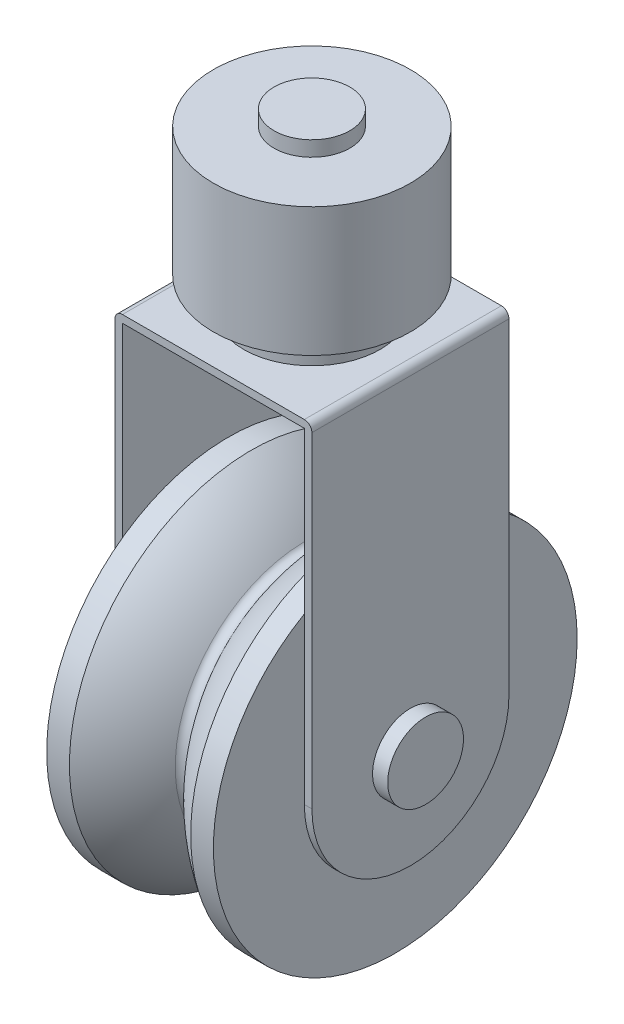
ISO-10303-21;
HEADER;
FILE_DESCRIPTION(('STEP AP214'),'2;1');
FILE_NAME('part.step','',(''),(''),'','','');
FILE_SCHEMA(('AUTOMOTIVE_DESIGN { 1 0 10303 214 1 1 1 1 }'));
ENDSEC;
DATA;
#1=APPLICATION_CONTEXT('core data for automotive mechanical design processes');
#2=APPLICATION_PROTOCOL_DEFINITION('international standard','automotive_design',2000,#1);
#3=PRODUCT_CONTEXT('',#1,'mechanical');
#4=PRODUCT('Part','Part','',(#3));
#5=PRODUCT_RELATED_PRODUCT_CATEGORY('part','',(#4));
#6=PRODUCT_DEFINITION_FORMATION('','',#4);
#7=PRODUCT_DEFINITION_CONTEXT('part definition',#1,'design');
#8=PRODUCT_DEFINITION('design','',#6,#7);
#9=PRODUCT_DEFINITION_SHAPE('','',#8);
#10=(LENGTH_UNIT() NAMED_UNIT(*) SI_UNIT(.MILLI.,.METRE.));
#11=(NAMED_UNIT(*) PLANE_ANGLE_UNIT() SI_UNIT($,.RADIAN.));
#12=(NAMED_UNIT(*) SI_UNIT($,.STERADIAN.) SOLID_ANGLE_UNIT());
#13=UNCERTAINTY_MEASURE_WITH_UNIT(LENGTH_MEASURE(1.E-05),#10,'distance_accuracy_value','');
#14=(GEOMETRIC_REPRESENTATION_CONTEXT(3) GLOBAL_UNCERTAINTY_ASSIGNED_CONTEXT((#13)) GLOBAL_UNIT_ASSIGNED_CONTEXT((#10,
#11,#12)) REPRESENTATION_CONTEXT('',''));
#15=CARTESIAN_POINT('',(0.,0.,0.));
#16=DIRECTION('',(0.,0.,1.));
#17=DIRECTION('',(1.,0.,0.));
#18=AXIS2_PLACEMENT_3D('',#15,#16,#17);
#19=CARTESIAN_POINT('',(-11.,0.,0.));
#20=DIRECTION('',(-1.,0.,0.));
#21=DIRECTION('',(0.,0.,1.));
#22=AXIS2_PLACEMENT_3D('',#19,#20,#21);
#23=PLANE('',#22);
#24=CARTESIAN_POINT('',(-11.,0.,0.));
#25=DIRECTION('',(1.,0.,0.));
#26=DIRECTION('',(0.,0.,-1.));
#27=AXIS2_PLACEMENT_3D('',#24,#25,#26);
#28=CIRCLE('',#27,24.);
#29=CARTESIAN_POINT('',(-11.,0.,-24.));
#30=VERTEX_POINT('',#29);
#31=EDGE_CURVE('E224',#30,#30,#28,.T.);
#32=ORIENTED_EDGE('',*,*,#31,.F.);
#33=EDGE_LOOP('',(#32));
#34=FACE_BOUND('',#33,.T.);
#35=CARTESIAN_POINT('',(-11.,0.,0.));
#36=DIRECTION('',(-1.,0.,0.));
#37=DIRECTION('',(0.,0.,1.));
#38=AXIS2_PLACEMENT_3D('',#35,#36,#37);
#39=CIRCLE('',#38,5.);
#40=CARTESIAN_POINT('',(-11.,0.,5.));
#41=VERTEX_POINT('',#40);
#42=EDGE_CURVE('E155',#41,#41,#39,.F.);
#43=ORIENTED_EDGE('',*,*,#42,.T.);
#44=EDGE_LOOP('',(#43));
#45=FACE_BOUND('',#44,.T.);
#46=ADVANCED_FACE('F46',(#34,#45),#23,.T.);
#47=CARTESIAN_POINT('',(-13.,0.,13.));
#48=DIRECTION('',(1.,0.,0.));
#49=DIRECTION('',(0.,0.,-1.));
#50=AXIS2_PLACEMENT_3D('',#47,#48,#49);
#51=PLANE('',#50);
#52=CARTESIAN_POINT('',(-13.,0.,0.));
#53=DIRECTION('',(1.,0.,0.));
#54=DIRECTION('',(0.,0.,-1.));
#55=AXIS2_PLACEMENT_3D('',#52,#53,#54);
#56=CIRCLE('',#55,5.);
#57=CARTESIAN_POINT('',(-13.,0.,-5.));
#58=VERTEX_POINT('',#57);
#59=EDGE_CURVE('E166',#58,#58,#56,.T.);
#60=ORIENTED_EDGE('',*,*,#59,.T.);
#61=EDGE_LOOP('',(#60));
#62=FACE_BOUND('',#61,.T.);
#63=DIRECTION('',(0.,-1.,0.));
#64=VECTOR('',#63,1.);
#65=CARTESIAN_POINT('',(-13.,0.,13.));
#66=LINE('',#65,#64);
#67=CARTESIAN_POINT('',(-13.,43.,13.));
#68=VERTEX_POINT('',#67);
#69=CARTESIAN_POINT('',(-13.,0.,13.));
#70=VERTEX_POINT('',#69);
#71=EDGE_CURVE('E177',#68,#70,#66,.T.);
#72=ORIENTED_EDGE('',*,*,#71,.F.);
#73=DIRECTION('',(0.,0.,-1.));
#74=VECTOR('',#73,1.);
#75=CARTESIAN_POINT('',(-13.,43.,-13.));
#76=LINE('',#75,#74);
#77=CARTESIAN_POINT('',(-13.,43.,-13.));
#78=VERTEX_POINT('',#77);
#79=EDGE_CURVE('E11',#68,#78,#76,.T.);
#80=ORIENTED_EDGE('',*,*,#79,.T.);
#81=DIRECTION('',(0.,-1.,0.));
#82=VECTOR('',#81,1.);
#83=CARTESIAN_POINT('',(-13.,0.,-13.));
#84=LINE('',#83,#82);
#85=CARTESIAN_POINT('',(-13.,0.,-13.));
#86=VERTEX_POINT('',#85);
#87=EDGE_CURVE('E146',#78,#86,#84,.T.);
#88=ORIENTED_EDGE('',*,*,#87,.T.);
#89=CARTESIAN_POINT('',(-13.,0.,0.));
#90=DIRECTION('',(1.,0.,0.));
#91=DIRECTION('',(0.,0.,-1.));
#92=AXIS2_PLACEMENT_3D('',#89,#90,#91);
#93=CIRCLE('',#92,13.);
#94=EDGE_CURVE('E145',#86,#70,#93,.F.);
#95=ORIENTED_EDGE('',*,*,#94,.T.);
#96=EDGE_LOOP('',(#72,#80,#88,#95));
#97=FACE_BOUND('',#96,.T.);
#98=ADVANCED_FACE('F273',(#62,#97),#51,.F.);
#99=CARTESIAN_POINT('',(-12.,0.,13.));
#100=DIRECTION('',(1.,0.,0.));
#101=DIRECTION('',(0.,0.,-1.));
#102=AXIS2_PLACEMENT_3D('',#99,#100,#101);
#103=PLANE('',#102);
#104=CARTESIAN_POINT('',(-12.,0.,0.));
#105=DIRECTION('',(-1.,0.,0.));
#106=DIRECTION('',(0.,0.,1.));
#107=AXIS2_PLACEMENT_3D('',#104,#105,#106);
#108=CIRCLE('',#107,5.);
#109=CARTESIAN_POINT('',(-12.,0.,5.));
#110=VERTEX_POINT('',#109);
#111=EDGE_CURVE('E162',#110,#110,#108,.T.);
#112=ORIENTED_EDGE('',*,*,#111,.T.);
#113=EDGE_LOOP('',(#112));
#114=FACE_BOUND('',#113,.T.);
#115=DIRECTION('',(0.,-1.,0.));
#116=VECTOR('',#115,1.);
#117=CARTESIAN_POINT('',(-12.,0.,13.));
#118=LINE('',#117,#116);
#119=CARTESIAN_POINT('',(-12.,43.,13.));
#120=VERTEX_POINT('',#119);
#121=CARTESIAN_POINT('',(-12.,0.,13.));
#122=VERTEX_POINT('',#121);
#123=EDGE_CURVE('E151',#120,#122,#118,.T.);
#124=ORIENTED_EDGE('',*,*,#123,.T.);
#125=CARTESIAN_POINT('',(-12.,0.,0.));
#126=DIRECTION('',(-1.,0.,0.));
#127=DIRECTION('',(0.,0.,1.));
#128=AXIS2_PLACEMENT_3D('',#125,#126,#127);
#129=CIRCLE('',#128,13.);
#130=CARTESIAN_POINT('',(-12.,0.,-13.));
#131=VERTEX_POINT('',#130);
#132=EDGE_CURVE('E143',#131,#122,#129,.T.);
#133=ORIENTED_EDGE('',*,*,#132,.F.);
#134=DIRECTION('',(0.,-1.,0.));
#135=VECTOR('',#134,1.);
#136=CARTESIAN_POINT('',(-12.,0.,-13.));
#137=LINE('',#136,#135);
#138=CARTESIAN_POINT('',(-12.,43.,-13.));
#139=VERTEX_POINT('',#138);
#140=EDGE_CURVE('E126',#139,#131,#137,.T.);
#141=ORIENTED_EDGE('',*,*,#140,.F.);
#142=DIRECTION('',(0.,0.,-1.));
#143=VECTOR('',#142,1.);
#144=CARTESIAN_POINT('',(-12.,43.,13.));
#145=LINE('',#144,#143);
#146=EDGE_CURVE('E202',#120,#139,#145,.T.);
#147=ORIENTED_EDGE('',*,*,#146,.F.);
#148=EDGE_LOOP('',(#124,#133,#141,#147));
#149=FACE_BOUND('',#148,.T.);
#150=ADVANCED_FACE('F149',(#114,#149),#103,.T.);
#151=CARTESIAN_POINT('',(15.,0.,0.));
#152=DIRECTION('',(-1.,0.,0.));
#153=DIRECTION('',(0.,0.,1.));
#154=AXIS2_PLACEMENT_3D('',#151,#152,#153);
#155=CYLINDRICAL_SURFACE('',#154,5.);
#156=CARTESIAN_POINT('',(11.,0.,0.));
#157=DIRECTION('',(-1.,0.,0.));
#158=DIRECTION('',(0.,0.,1.));
#159=AXIS2_PLACEMENT_3D('',#156,#157,#158);
#160=CIRCLE('',#159,5.);
#161=CARTESIAN_POINT('',(11.,0.,5.));
#162=VERTEX_POINT('',#161);
#163=EDGE_CURVE('E217',#162,#162,#160,.F.);
#164=ORIENTED_EDGE('',*,*,#163,.T.);
#165=EDGE_LOOP('',(#164));
#166=FACE_BOUND('',#165,.T.);
#167=CARTESIAN_POINT('',(12.,0.,0.));
#168=DIRECTION('',(-1.,0.,0.));
#169=DIRECTION('',(0.,0.,1.));
#170=AXIS2_PLACEMENT_3D('',#167,#168,#169);
#171=CIRCLE('',#170,5.);
#172=CARTESIAN_POINT('',(12.,0.,5.));
#173=VERTEX_POINT('',#172);
#174=EDGE_CURVE('E220',#173,#173,#171,.T.);
#175=ORIENTED_EDGE('',*,*,#174,.T.);
#176=EDGE_LOOP('',(#175));
#177=FACE_BOUND('',#176,.T.);
#178=ADVANCED_FACE('F251',(#166,#177),#155,.T.);
#179=CARTESIAN_POINT('',(11.,0.,0.));
#180=DIRECTION('',(-1.,0.,0.));
#181=DIRECTION('',(0.,0.,1.));
#182=AXIS2_PLACEMENT_3D('',#179,#180,#181);
#183=PLANE('',#182);
#184=ORIENTED_EDGE('',*,*,#163,.F.);
#185=EDGE_LOOP('',(#184));
#186=FACE_BOUND('',#185,.T.);
#187=CARTESIAN_POINT('',(11.,0.,0.));
#188=DIRECTION('',(1.,0.,0.));
#189=DIRECTION('',(0.,0.,-1.));
#190=AXIS2_PLACEMENT_3D('',#187,#188,#189);
#191=CIRCLE('',#190,24.);
#192=CARTESIAN_POINT('',(11.,0.,-24.));
#193=VERTEX_POINT('',#192);
#194=EDGE_CURVE('E302',#193,#193,#191,.T.);
#195=ORIENTED_EDGE('',*,*,#194,.T.);
#196=EDGE_LOOP('',(#195));
#197=FACE_BOUND('',#196,.T.);
#198=ADVANCED_FACE('F247',(#186,#197),#183,.F.);
#199=CARTESIAN_POINT('',(11.,0.,0.));
#200=DIRECTION('',(1.,0.,0.));
#201=DIRECTION('',(0.,0.,-1.));
#202=AXIS2_PLACEMENT_3D('',#199,#200,#201);
#203=CYLINDRICAL_SURFACE('',#202,24.);
#204=ORIENTED_EDGE('',*,*,#194,.F.);
#205=EDGE_LOOP('',(#204));
#206=FACE_BOUND('',#205,.T.);
#207=CARTESIAN_POINT('',(8.,0.,0.));
#208=DIRECTION('',(1.,0.,0.));
#209=DIRECTION('',(0.,0.,-1.));
#210=AXIS2_PLACEMENT_3D('',#207,#208,#209);
#211=CIRCLE('',#210,24.);
#212=CARTESIAN_POINT('',(8.,0.,-24.));
#213=VERTEX_POINT('',#212);
#214=EDGE_CURVE('E299',#213,#213,#211,.T.);
#215=ORIENTED_EDGE('',*,*,#214,.T.);
#216=EDGE_LOOP('',(#215));
#217=FACE_BOUND('',#216,.T.);
#218=ADVANCED_FACE('F242',(#206,#217),#203,.T.);
#219=CARTESIAN_POINT('',(0.,16.,0.));
#220=CARTESIAN_POINT('',(3.20032802278915,21.0713324963229,0.));
#221=CARTESIAN_POINT('',(8.,24.,0.));
#222=B_SPLINE_CURVE_WITH_KNOTS('',2,(#219,#220,#221),.UNSPECIFIED.,.F.,.F.,(3,3),(0.,
0.822363044942097),.UNSPECIFIED.);
#223=CARTESIAN_POINT('',(11.,0.,0.));
#224=DIRECTION('',(1.,0.,0.));
#225=AXIS1_PLACEMENT('',#223,#224);
#226=SURFACE_OF_REVOLUTION('',#222,#225);
#227=CARTESIAN_POINT('',(0.816517385690031,0.,0.));
#228=DIRECTION('',(1.,0.,0.));
#229=DIRECTION('',(0.,0.,-1.));
#230=AXIS2_PLACEMENT_3D('',#227,#228,#229);
#231=CIRCLE('',#230,17.222262327369);
#232=CARTESIAN_POINT('',(0.816517385690031,0.,-17.222262327369));
#233=VERTEX_POINT('',#232);
#234=EDGE_CURVE('E307',#233,#233,#231,.T.);
#235=ORIENTED_EDGE('',*,*,#234,.T.);
#236=EDGE_LOOP('',(#235));
#237=FACE_BOUND('',#236,.T.);
#238=ORIENTED_EDGE('',*,*,#214,.F.);
#239=EDGE_LOOP('',(#238));
#240=FACE_BOUND('',#239,.T.);
#241=ADVANCED_FACE('F237',(#237,#240),#226,.T.);
#242=CARTESIAN_POINT('',(0.,16.,0.));
#243=CARTESIAN_POINT('',(-3.20032802278915,21.0713324963229,0.));
#244=CARTESIAN_POINT('',(-8.,24.,0.));
#245=B_SPLINE_CURVE_WITH_KNOTS('',2,(#242,#243,#244),.UNSPECIFIED.,.F.,.F.,(3,3),(0.,
0.822363044942097),.UNSPECIFIED.);
#246=CARTESIAN_POINT('',(11.,0.,0.));
#247=DIRECTION('',(1.,0.,0.));
#248=AXIS1_PLACEMENT('',#246,#247);
#249=SURFACE_OF_REVOLUTION('',#245,#248);
#250=CARTESIAN_POINT('',(-0.816517385690184,0.,0.));
#251=DIRECTION('',(1.,0.,0.));
#252=DIRECTION('',(0.,0.,-1.));
#253=AXIS2_PLACEMENT_3D('',#250,#251,#252);
#254=CIRCLE('',#253,17.2222623273693);
#255=CARTESIAN_POINT('',(-0.816517385690184,0.,-17.2222623273693));
#256=VERTEX_POINT('',#255);
#257=EDGE_CURVE('E221',#256,#256,#254,.F.);
#258=ORIENTED_EDGE('',*,*,#257,.T.);
#259=EDGE_LOOP('',(#258));
#260=FACE_BOUND('',#259,.T.);
#261=CARTESIAN_POINT('',(-8.,0.,0.));
#262=DIRECTION('',(1.,0.,0.));
#263=DIRECTION('',(0.,0.,-1.));
#264=AXIS2_PLACEMENT_3D('',#261,#262,#263);
#265=CIRCLE('',#264,24.);
#266=CARTESIAN_POINT('',(-8.,0.,-24.));
#267=VERTEX_POINT('',#266);
#268=EDGE_CURVE('E297',#267,#267,#265,.T.);
#269=ORIENTED_EDGE('',*,*,#268,.T.);
#270=EDGE_LOOP('',(#269));
#271=FACE_BOUND('',#270,.T.);
#272=ADVANCED_FACE('F241',(#260,#271),#249,.F.);
#273=CARTESIAN_POINT('',(11.,0.,0.));
#274=DIRECTION('',(1.,0.,0.));
#275=DIRECTION('',(0.,0.,-1.));
#276=AXIS2_PLACEMENT_3D('',#273,#274,#275);
#277=CYLINDRICAL_SURFACE('',#276,24.);
#278=ORIENTED_EDGE('',*,*,#31,.T.);
#279=EDGE_LOOP('',(#278));
#280=FACE_BOUND('',#279,.T.);
#281=ORIENTED_EDGE('',*,*,#268,.F.);
#282=EDGE_LOOP('',(#281));
#283=FACE_BOUND('',#282,.T.);
#284=ADVANCED_FACE('F256',(#280,#283),#277,.T.);
#285=CARTESIAN_POINT('',(0.,0.,0.));
#286=DIRECTION('',(1.,0.,0.));
#287=DIRECTION('',(0.,0.,-1.));
#288=AXIS2_PLACEMENT_3D('',#285,#286,#287);
#289=TOROIDAL_SURFACE('',#288,17.7995831730571,1.);
#290=ORIENTED_EDGE('',*,*,#257,.F.);
#291=EDGE_LOOP('',(#290));
#292=FACE_BOUND('',#291,.T.);
#293=ORIENTED_EDGE('',*,*,#234,.F.);
#294=EDGE_LOOP('',(#293));
#295=FACE_BOUND('',#294,.T.);
#296=ADVANCED_FACE('F253',(#292,#295),#289,.F.);
#297=CARTESIAN_POINT('',(13.,0.,0.));
#298=DIRECTION('',(1.,0.,0.));
#299=DIRECTION('',(0.,0.,-1.));
#300=AXIS2_PLACEMENT_3D('',#297,#298,#299);
#301=CIRCLE('',#300,5.);
#302=CARTESIAN_POINT('',(13.,0.,-5.));
#303=VERTEX_POINT('',#302);
#304=EDGE_CURVE('E176',#303,#303,#301,.T.);
#305=ORIENTED_EDGE('',*,*,#304,.T.);
#306=EDGE_LOOP('',(#305));
#307=FACE_BOUND('',#306,.T.);
#308=CARTESIAN_POINT('',(15.,0.,0.));
#309=DIRECTION('',(1.,0.,0.));
#310=DIRECTION('',(0.,0.,-1.));
#311=AXIS2_PLACEMENT_3D('',#308,#309,#310);
#312=CIRCLE('',#311,5.);
#313=CARTESIAN_POINT('',(15.,0.,-5.));
#314=VERTEX_POINT('',#313);
#315=EDGE_CURVE('E212',#314,#314,#312,.T.);
#316=ORIENTED_EDGE('',*,*,#315,.F.);
#317=EDGE_LOOP('',(#316));
#318=FACE_BOUND('',#317,.T.);
#319=ADVANCED_FACE('F255',(#307,#318),#155,.T.);
#320=CARTESIAN_POINT('',(15.,0.,0.));
#321=DIRECTION('',(1.,0.,0.));
#322=DIRECTION('',(0.,0.,-1.));
#323=AXIS2_PLACEMENT_3D('',#320,#321,#322);
#324=PLANE('',#323);
#325=ORIENTED_EDGE('',*,*,#315,.T.);
#326=EDGE_LOOP('',(#325));
#327=FACE_BOUND('',#326,.T.);
#328=ADVANCED_FACE('F364',(#327),#324,.T.);
#329=CARTESIAN_POINT('',(-17.0688837074973,0.,0.));
#330=DIRECTION('',(1.,0.,0.));
#331=DIRECTION('',(0.,0.,-1.));
#332=AXIS2_PLACEMENT_3D('',#329,#330,#331);
#333=CYLINDRICAL_SURFACE('',#332,13.);
#334=CARTESIAN_POINT('',(12.,0.,0.));
#335=DIRECTION('',(-1.,0.,0.));
#336=DIRECTION('',(0.,0.,1.));
#337=AXIS2_PLACEMENT_3D('',#334,#335,#336);
#338=CIRCLE('',#337,13.);
#339=CARTESIAN_POINT('',(12.,0.,-13.));
#340=VERTEX_POINT('',#339);
#341=CARTESIAN_POINT('',(12.,0.,13.));
#342=VERTEX_POINT('',#341);
#343=EDGE_CURVE('E209',#340,#342,#338,.T.);
#344=ORIENTED_EDGE('',*,*,#343,.F.);
#345=DIRECTION('',(1.,0.,0.));
#346=VECTOR('',#345,1.);
#347=CARTESIAN_POINT('',(-17.0688837074973,0.,-13.));
#348=LINE('',#347,#346);
#349=CARTESIAN_POINT('',(13.,0.,-13.));
#350=VERTEX_POINT('',#349);
#351=EDGE_CURVE('E204',#340,#350,#348,.T.);
#352=ORIENTED_EDGE('',*,*,#351,.T.);
#353=CARTESIAN_POINT('',(13.,0.,0.));
#354=DIRECTION('',(1.,0.,0.));
#355=DIRECTION('',(0.,0.,-1.));
#356=AXIS2_PLACEMENT_3D('',#353,#354,#355);
#357=CIRCLE('',#356,13.);
#358=CARTESIAN_POINT('',(13.,0.,13.));
#359=VERTEX_POINT('',#358);
#360=EDGE_CURVE('E205',#350,#359,#357,.F.);
#361=ORIENTED_EDGE('',*,*,#360,.T.);
#362=DIRECTION('',(1.,0.,0.));
#363=VECTOR('',#362,1.);
#364=CARTESIAN_POINT('',(-17.0688837074973,0.,13.));
#365=LINE('',#364,#363);
#366=EDGE_CURVE('E208',#342,#359,#365,.T.);
#367=ORIENTED_EDGE('',*,*,#366,.F.);
#368=EDGE_LOOP('',(#344,#352,#361,#367));
#369=FACE_BOUND('',#368,.T.);
#370=ADVANCED_FACE('F338',(#369),#333,.T.);
#371=CARTESIAN_POINT('',(13.,0.,0.));
#372=DIRECTION('',(1.,0.,0.));
#373=DIRECTION('',(0.,0.,-1.));
#374=AXIS2_PLACEMENT_3D('',#371,#372,#373);
#375=PLANE('',#374);
#376=ORIENTED_EDGE('',*,*,#304,.F.);
#377=EDGE_LOOP('',(#376));
#378=FACE_BOUND('',#377,.T.);
#379=DIRECTION('',(0.,-1.,0.));
#380=VECTOR('',#379,1.);
#381=CARTESIAN_POINT('',(13.,0.,-13.));
#382=LINE('',#381,#380);
#383=CARTESIAN_POINT('',(13.,43.,-13.));
#384=VERTEX_POINT('',#383);
#385=EDGE_CURVE('E198',#384,#350,#382,.T.);
#386=ORIENTED_EDGE('',*,*,#385,.F.);
#387=DIRECTION('',(0.,0.,-1.));
#388=VECTOR('',#387,1.);
#389=CARTESIAN_POINT('',(13.,43.,0.));
#390=LINE('',#389,#388);
#391=CARTESIAN_POINT('',(13.,43.,13.));
#392=VERTEX_POINT('',#391);
#393=EDGE_CURVE('E69',#384,#392,#390,.F.);
#394=ORIENTED_EDGE('',*,*,#393,.T.);
#395=DIRECTION('',(0.,-1.,0.));
#396=VECTOR('',#395,1.);
#397=CARTESIAN_POINT('',(13.,0.,13.));
#398=LINE('',#397,#396);
#399=EDGE_CURVE('E188',#392,#359,#398,.T.);
#400=ORIENTED_EDGE('',*,*,#399,.T.);
#401=ORIENTED_EDGE('',*,*,#360,.F.);
#402=EDGE_LOOP('',(#386,#394,#400,#401));
#403=FACE_BOUND('',#402,.T.);
#404=ADVANCED_FACE('F334',(#378,#403),#375,.T.);
#405=CARTESIAN_POINT('',(12.,0.,13.));
#406=DIRECTION('',(-1.,0.,0.));
#407=DIRECTION('',(0.,0.,1.));
#408=AXIS2_PLACEMENT_3D('',#405,#406,#407);
#409=PLANE('',#408);
#410=ORIENTED_EDGE('',*,*,#174,.F.);
#411=EDGE_LOOP('',(#410));
#412=FACE_BOUND('',#411,.T.);
#413=ORIENTED_EDGE('',*,*,#343,.T.);
#414=DIRECTION('',(0.,1.,0.));
#415=VECTOR('',#414,1.);
#416=CARTESIAN_POINT('',(12.,0.,13.));
#417=LINE('',#416,#415);
#418=CARTESIAN_POINT('',(12.,43.,13.));
#419=VERTEX_POINT('',#418);
#420=EDGE_CURVE('E185',#342,#419,#417,.T.);
#421=ORIENTED_EDGE('',*,*,#420,.T.);
#422=DIRECTION('',(0.,0.,-1.));
#423=VECTOR('',#422,1.);
#424=CARTESIAN_POINT('',(12.,43.,13.));
#425=LINE('',#424,#423);
#426=CARTESIAN_POINT('',(12.,43.,-13.));
#427=VERTEX_POINT('',#426);
#428=EDGE_CURVE('E193',#419,#427,#425,.T.);
#429=ORIENTED_EDGE('',*,*,#428,.T.);
#430=DIRECTION('',(0.,1.,0.));
#431=VECTOR('',#430,1.);
#432=CARTESIAN_POINT('',(12.,0.,-13.));
#433=LINE('',#432,#431);
#434=EDGE_CURVE('E196',#340,#427,#433,.T.);
#435=ORIENTED_EDGE('',*,*,#434,.F.);
#436=EDGE_LOOP('',(#413,#421,#429,#435));
#437=FACE_BOUND('',#436,.T.);
#438=ADVANCED_FACE('F340',(#412,#437),#409,.T.);
#439=CARTESIAN_POINT('',(0.,43.,13.));
#440=DIRECTION('',(0.,1.,0.));
#441=DIRECTION('',(0.,0.,1.));
#442=AXIS2_PLACEMENT_3D('',#439,#440,#441);
#443=PLANE('',#442);
#444=DIRECTION('',(1.,0.,0.));
#445=VECTOR('',#444,1.);
#446=CARTESIAN_POINT('',(0.,43.,-13.));
#447=LINE('',#446,#445);
#448=EDGE_CURVE('E135',#139,#427,#447,.T.);
#449=ORIENTED_EDGE('',*,*,#448,.T.);
#450=ORIENTED_EDGE('',*,*,#428,.F.);
#451=DIRECTION('',(1.,0.,0.));
#452=VECTOR('',#451,1.);
#453=CARTESIAN_POINT('',(0.,43.,13.));
#454=LINE('',#453,#452);
#455=EDGE_CURVE('E183',#120,#419,#454,.T.);
#456=ORIENTED_EDGE('',*,*,#455,.F.);
#457=ORIENTED_EDGE('',*,*,#146,.T.);
#458=EDGE_LOOP('',(#449,#450,#456,#457));
#459=FACE_BOUND('',#458,.T.);
#460=ADVANCED_FACE('F344',(#459),#443,.F.);
#461=CARTESIAN_POINT('',(0.,44.,13.));
#462=DIRECTION('',(0.,1.,0.));
#463=DIRECTION('',(0.,0.,1.));
#464=AXIS2_PLACEMENT_3D('',#461,#462,#463);
#465=PLANE('',#464);
#466=CARTESIAN_POINT('',(0.,44.,0.));
#467=DIRECTION('',(0.,1.,0.));
#468=DIRECTION('',(0.,0.,1.));
#469=AXIS2_PLACEMENT_3D('',#466,#467,#468);
#470=CIRCLE('',#469,9.);
#471=CARTESIAN_POINT('',(0.,44.,9.));
#472=VERTEX_POINT('',#471);
#473=EDGE_CURVE('E172',#472,#472,#470,.T.);
#474=ORIENTED_EDGE('',*,*,#473,.F.);
#475=EDGE_LOOP('',(#474));
#476=FACE_BOUND('',#475,.T.);
#477=DIRECTION('',(1.,0.,0.));
#478=VECTOR('',#477,1.);
#479=CARTESIAN_POINT('',(0.,44.,13.));
#480=LINE('',#479,#478);
#481=CARTESIAN_POINT('',(-12.,44.,13.));
#482=VERTEX_POINT('',#481);
#483=CARTESIAN_POINT('',(12.,44.,13.));
#484=VERTEX_POINT('',#483);
#485=EDGE_CURVE('E190',#482,#484,#480,.T.);
#486=ORIENTED_EDGE('',*,*,#485,.T.);
#487=DIRECTION('',(0.,0.,-1.));
#488=VECTOR('',#487,1.);
#489=CARTESIAN_POINT('',(12.,44.,13.));
#490=LINE('',#489,#488);
#491=CARTESIAN_POINT('',(12.,44.,-13.));
#492=VERTEX_POINT('',#491);
#493=EDGE_CURVE('E318',#484,#492,#490,.T.);
#494=ORIENTED_EDGE('',*,*,#493,.T.);
#495=DIRECTION('',(1.,0.,0.));
#496=VECTOR('',#495,1.);
#497=CARTESIAN_POINT('',(0.,44.,-13.));
#498=LINE('',#497,#496);
#499=CARTESIAN_POINT('',(-12.,44.,-13.));
#500=VERTEX_POINT('',#499);
#501=EDGE_CURVE('E180',#500,#492,#498,.T.);
#502=ORIENTED_EDGE('',*,*,#501,.F.);
#503=DIRECTION('',(0.,0.,-1.));
#504=VECTOR('',#503,1.);
#505=CARTESIAN_POINT('',(-12.,44.,13.));
#506=LINE('',#505,#504);
#507=EDGE_CURVE('E316',#500,#482,#506,.F.);
#508=ORIENTED_EDGE('',*,*,#507,.T.);
#509=EDGE_LOOP('',(#486,#494,#502,#508));
#510=FACE_BOUND('',#509,.T.);
#511=ADVANCED_FACE('F329',(#476,#510),#465,.T.);
#512=CARTESIAN_POINT('',(0.,0.,13.));
#513=DIRECTION('',(0.,0.,1.));
#514=DIRECTION('',(1.,0.,0.));
#515=AXIS2_PLACEMENT_3D('',#512,#513,#514);
#516=PLANE('',#515);
#517=ORIENTED_EDGE('',*,*,#399,.F.);
#518=CARTESIAN_POINT('',(12.,43.,13.));
#519=DIRECTION('',(0.,0.,1.));
#520=DIRECTION('',(1.,0.,0.));
#521=AXIS2_PLACEMENT_3D('',#518,#519,#520);
#522=CIRCLE('',#521,1.);
#523=EDGE_CURVE('E54',#392,#484,#522,.T.);
#524=ORIENTED_EDGE('',*,*,#523,.T.);
#525=ORIENTED_EDGE('',*,*,#485,.F.);
#526=CARTESIAN_POINT('',(-12.,43.,13.));
#527=DIRECTION('',(0.,0.,1.));
#528=DIRECTION('',(1.,0.,0.));
#529=AXIS2_PLACEMENT_3D('',#526,#527,#528);
#530=CIRCLE('',#529,1.);
#531=EDGE_CURVE('E61',#482,#68,#530,.T.);
#532=ORIENTED_EDGE('',*,*,#531,.T.);
#533=ORIENTED_EDGE('',*,*,#71,.T.);
#534=DIRECTION('',(1.,0.,0.));
#535=VECTOR('',#534,1.);
#536=CARTESIAN_POINT('',(0.,0.,13.));
#537=LINE('',#536,#535);
#538=EDGE_CURVE('E179',#70,#122,#537,.T.);
#539=ORIENTED_EDGE('',*,*,#538,.T.);
#540=ORIENTED_EDGE('',*,*,#123,.F.);
#541=ORIENTED_EDGE('',*,*,#455,.T.);
#542=ORIENTED_EDGE('',*,*,#420,.F.);
#543=ORIENTED_EDGE('',*,*,#366,.T.);
#544=EDGE_LOOP('',(#517,#524,#525,#532,#533,#539,#540,#541,#542,#543));
#545=FACE_BOUND('',#544,.T.);
#546=ADVANCED_FACE('F326',(#545),#516,.T.);
#547=CARTESIAN_POINT('',(0.,0.,-13.));
#548=DIRECTION('',(0.,0.,1.));
#549=DIRECTION('',(1.,0.,0.));
#550=AXIS2_PLACEMENT_3D('',#547,#548,#549);
#551=PLANE('',#550);
#552=ORIENTED_EDGE('',*,*,#501,.T.);
#553=CARTESIAN_POINT('',(12.,43.,-13.));
#554=DIRECTION('',(0.,0.,1.));
#555=DIRECTION('',(1.,0.,0.));
#556=AXIS2_PLACEMENT_3D('',#553,#554,#555);
#557=CIRCLE('',#556,1.);
#558=EDGE_CURVE('E323',#492,#384,#557,.F.);
#559=ORIENTED_EDGE('',*,*,#558,.T.);
#560=ORIENTED_EDGE('',*,*,#385,.T.);
#561=ORIENTED_EDGE('',*,*,#351,.F.);
#562=ORIENTED_EDGE('',*,*,#434,.T.);
#563=ORIENTED_EDGE('',*,*,#448,.F.);
#564=ORIENTED_EDGE('',*,*,#140,.T.);
#565=DIRECTION('',(1.,0.,0.));
#566=VECTOR('',#565,1.);
#567=CARTESIAN_POINT('',(0.,0.,-13.));
#568=LINE('',#567,#566);
#569=EDGE_CURVE('E131',#86,#131,#568,.T.);
#570=ORIENTED_EDGE('',*,*,#569,.F.);
#571=ORIENTED_EDGE('',*,*,#87,.F.);
#572=CARTESIAN_POINT('',(-12.,43.,-13.));
#573=DIRECTION('',(0.,0.,1.));
#574=DIRECTION('',(1.,0.,0.));
#575=AXIS2_PLACEMENT_3D('',#572,#573,#574);
#576=CIRCLE('',#575,1.);
#577=EDGE_CURVE('E321',#78,#500,#576,.F.);
#578=ORIENTED_EDGE('',*,*,#577,.T.);
#579=EDGE_LOOP('',(#552,#559,#560,#561,#562,#563,#564,#570,#571,#578));
#580=FACE_BOUND('',#579,.T.);
#581=ADVANCED_FACE('F129',(#580),#551,.F.);
#582=CARTESIAN_POINT('',(0.,48.,0.));
#583=DIRECTION('',(0.,-1.,0.));
#584=DIRECTION('',(0.,0.,-1.));
#585=AXIS2_PLACEMENT_3D('',#582,#583,#584);
#586=CYLINDRICAL_SURFACE('',#585,9.);
#587=CARTESIAN_POINT('',(0.,48.,0.));
#588=DIRECTION('',(0.,1.,0.));
#589=DIRECTION('',(0.,0.,1.));
#590=AXIS2_PLACEMENT_3D('',#587,#588,#589);
#591=CIRCLE('',#590,9.);
#592=CARTESIAN_POINT('',(0.,48.,9.));
#593=VERTEX_POINT('',#592);
#594=EDGE_CURVE('E169',#593,#593,#591,.T.);
#595=ORIENTED_EDGE('',*,*,#594,.F.);
#596=EDGE_LOOP('',(#595));
#597=FACE_BOUND('',#596,.T.);
#598=ORIENTED_EDGE('',*,*,#473,.T.);
#599=EDGE_LOOP('',(#598));
#600=FACE_BOUND('',#599,.T.);
#601=ADVANCED_FACE('F413',(#597,#600),#586,.T.);
#602=CARTESIAN_POINT('',(-15.,0.,0.));
#603=DIRECTION('',(1.,0.,0.));
#604=DIRECTION('',(0.,0.,1.));
#605=AXIS2_PLACEMENT_3D('',#602,#603,#604);
#606=CYLINDRICAL_SURFACE('',#605,5.);
#607=ORIENTED_EDGE('',*,*,#42,.F.);
#608=EDGE_LOOP('',(#607));
#609=FACE_BOUND('',#608,.T.);
#610=ORIENTED_EDGE('',*,*,#111,.F.);
#611=EDGE_LOOP('',(#610));
#612=FACE_BOUND('',#611,.T.);
#613=ADVANCED_FACE('F418',(#609,#612),#606,.T.);
#614=ORIENTED_EDGE('',*,*,#59,.F.);
#615=EDGE_LOOP('',(#614));
#616=FACE_BOUND('',#615,.T.);
#617=CARTESIAN_POINT('',(-15.,0.,0.));
#618=DIRECTION('',(1.,0.,0.));
#619=DIRECTION('',(0.,0.,-1.));
#620=AXIS2_PLACEMENT_3D('',#617,#618,#619);
#621=CIRCLE('',#620,5.);
#622=CARTESIAN_POINT('',(-15.,0.,-5.));
#623=VERTEX_POINT('',#622);
#624=EDGE_CURVE('E152',#623,#623,#621,.T.);
#625=ORIENTED_EDGE('',*,*,#624,.T.);
#626=EDGE_LOOP('',(#625));
#627=FACE_BOUND('',#626,.T.);
#628=ADVANCED_FACE('F471',(#616,#627),#606,.T.);
#629=CARTESIAN_POINT('',(-15.,0.,0.));
#630=DIRECTION('',(-1.,0.,0.));
#631=DIRECTION('',(0.,0.,-1.));
#632=AXIS2_PLACEMENT_3D('',#629,#630,#631);
#633=PLANE('',#632);
#634=ORIENTED_EDGE('',*,*,#624,.F.);
#635=EDGE_LOOP('',(#634));
#636=FACE_BOUND('',#635,.T.);
#637=ADVANCED_FACE('F468',(#636),#633,.T.);
#638=CARTESIAN_POINT('',(17.0688837074973,0.,0.));
#639=DIRECTION('',(-1.,0.,0.));
#640=DIRECTION('',(0.,0.,-1.));
#641=AXIS2_PLACEMENT_3D('',#638,#639,#640);
#642=CYLINDRICAL_SURFACE('',#641,13.);
#643=ORIENTED_EDGE('',*,*,#132,.T.);
#644=ORIENTED_EDGE('',*,*,#538,.F.);
#645=ORIENTED_EDGE('',*,*,#94,.F.);
#646=ORIENTED_EDGE('',*,*,#569,.T.);
#647=EDGE_LOOP('',(#643,#644,#645,#646));
#648=FACE_BOUND('',#647,.T.);
#649=ADVANCED_FACE('F141',(#648),#642,.T.);
#650=CARTESIAN_POINT('',(0.,65.,0.));
#651=DIRECTION('',(0.,-1.,0.));
#652=DIRECTION('',(0.,0.,-1.));
#653=AXIS2_PLACEMENT_3D('',#650,#651,#652);
#654=CYLINDRICAL_SURFACE('',#653,13.);
#655=CARTESIAN_POINT('',(0.,65.,0.));
#656=DIRECTION('',(0.,1.,0.));
#657=DIRECTION('',(0.,0.,1.));
#658=AXIS2_PLACEMENT_3D('',#655,#656,#657);
#659=CIRCLE('',#658,13.);
#660=CARTESIAN_POINT('',(0.,65.,13.));
#661=VERTEX_POINT('',#660);
#662=EDGE_CURVE('E157',#661,#661,#659,.T.);
#663=ORIENTED_EDGE('',*,*,#662,.F.);
#664=EDGE_LOOP('',(#663));
#665=FACE_BOUND('',#664,.T.);
#666=CARTESIAN_POINT('',(0.,48.,0.));
#667=DIRECTION('',(0.,1.,0.));
#668=DIRECTION('',(0.,0.,1.));
#669=AXIS2_PLACEMENT_3D('',#666,#667,#668);
#670=CIRCLE('',#669,13.);
#671=CARTESIAN_POINT('',(0.,48.,13.));
#672=VERTEX_POINT('',#671);
#673=EDGE_CURVE('E592',#672,#672,#670,.T.);
#674=ORIENTED_EDGE('',*,*,#673,.T.);
#675=EDGE_LOOP('',(#674));
#676=FACE_BOUND('',#675,.T.);
#677=ADVANCED_FACE('F423',(#665,#676),#654,.T.);
#678=CARTESIAN_POINT('',(0.,65.,0.));
#679=DIRECTION('',(0.,1.,0.));
#680=DIRECTION('',(0.,0.,1.));
#681=AXIS2_PLACEMENT_3D('',#678,#679,#680);
#682=PLANE('',#681);
#683=CARTESIAN_POINT('',(0.,65.,0.));
#684=DIRECTION('',(0.,1.,0.));
#685=DIRECTION('',(0.,0.,1.));
#686=AXIS2_PLACEMENT_3D('',#683,#684,#685);
#687=CIRCLE('',#686,5.);
#688=CARTESIAN_POINT('',(0.,65.,5.));
#689=VERTEX_POINT('',#688);
#690=EDGE_CURVE('E175',#689,#689,#687,.T.);
#691=ORIENTED_EDGE('',*,*,#690,.F.);
#692=EDGE_LOOP('',(#691));
#693=FACE_BOUND('',#692,.T.);
#694=ORIENTED_EDGE('',*,*,#662,.T.);
#695=EDGE_LOOP('',(#694));
#696=FACE_BOUND('',#695,.T.);
#697=ADVANCED_FACE('F428',(#693,#696),#682,.T.);
#698=CARTESIAN_POINT('',(0.,48.,0.));
#699=DIRECTION('',(0.,1.,0.));
#700=DIRECTION('',(0.,0.,1.));
#701=AXIS2_PLACEMENT_3D('',#698,#699,#700);
#702=PLANE('',#701);
#703=ORIENTED_EDGE('',*,*,#594,.T.);
#704=EDGE_LOOP('',(#703));
#705=FACE_BOUND('',#704,.T.);
#706=ORIENTED_EDGE('',*,*,#673,.F.);
#707=EDGE_LOOP('',(#706));
#708=FACE_BOUND('',#707,.T.);
#709=ADVANCED_FACE('F438',(#705,#708),#702,.F.);
#710=CARTESIAN_POINT('',(0.,67.,0.));
#711=DIRECTION('',(0.,-1.,0.));
#712=DIRECTION('',(0.,0.,-1.));
#713=AXIS2_PLACEMENT_3D('',#710,#711,#712);
#714=CYLINDRICAL_SURFACE('',#713,5.);
#715=CARTESIAN_POINT('',(0.,67.,0.));
#716=DIRECTION('',(0.,1.,0.));
#717=DIRECTION('',(0.,0.,1.));
#718=AXIS2_PLACEMENT_3D('',#715,#716,#717);
#719=CIRCLE('',#718,5.);
#720=CARTESIAN_POINT('',(0.,67.,5.));
#721=VERTEX_POINT('',#720);
#722=EDGE_CURVE('E585',#721,#721,#719,.T.);
#723=ORIENTED_EDGE('',*,*,#722,.F.);
#724=EDGE_LOOP('',(#723));
#725=FACE_BOUND('',#724,.T.);
#726=ORIENTED_EDGE('',*,*,#690,.T.);
#727=EDGE_LOOP('',(#726));
#728=FACE_BOUND('',#727,.T.);
#729=ADVANCED_FACE('F268',(#725,#728),#714,.T.);
#730=CARTESIAN_POINT('',(0.,67.,0.));
#731=DIRECTION('',(0.,1.,0.));
#732=DIRECTION('',(0.,0.,1.));
#733=AXIS2_PLACEMENT_3D('',#730,#731,#732);
#734=PLANE('',#733);
#735=ORIENTED_EDGE('',*,*,#722,.T.);
#736=EDGE_LOOP('',(#735));
#737=FACE_BOUND('',#736,.T.);
#738=ADVANCED_FACE('F260',(#737),#734,.T.);
#739=CARTESIAN_POINT('',(12.,43.,13.));
#740=DIRECTION('',(0.,0.,-1.));
#741=DIRECTION('',(-1.,0.,0.));
#742=AXIS2_PLACEMENT_3D('',#739,#740,#741);
#743=CYLINDRICAL_SURFACE('',#742,1.);
#744=ORIENTED_EDGE('',*,*,#523,.F.);
#745=ORIENTED_EDGE('',*,*,#393,.F.);
#746=ORIENTED_EDGE('',*,*,#558,.F.);
#747=ORIENTED_EDGE('',*,*,#493,.F.);
#748=EDGE_LOOP('',(#744,#745,#746,#747));
#749=FACE_BOUND('',#748,.T.);
#750=ADVANCED_FACE('F258',(#749),#743,.T.);
#751=CARTESIAN_POINT('',(-12.,43.,13.));
#752=DIRECTION('',(0.,0.,1.));
#753=DIRECTION('',(1.,0.,0.));
#754=AXIS2_PLACEMENT_3D('',#751,#752,#753);
#755=CYLINDRICAL_SURFACE('',#754,1.);
#756=ORIENTED_EDGE('',*,*,#531,.F.);
#757=ORIENTED_EDGE('',*,*,#507,.F.);
#758=ORIENTED_EDGE('',*,*,#577,.F.);
#759=ORIENTED_EDGE('',*,*,#79,.F.);
#760=EDGE_LOOP('',(#756,#757,#758,#759));
#761=FACE_BOUND('',#760,.T.);
#762=ADVANCED_FACE('F48',(#761),#755,.T.);
#763=CLOSED_SHELL('',(#46,#98,#150,#178,#198,#218,#241,#272,#284,#296,#319,#328,#370,#404,#438,
#460,#511,#546,#581,#601,#613,#628,#637,#649,#677,#697,#709,#729,#738,#750,#762));
#764=MANIFOLD_SOLID_BREP('B2',#763);
#765=ADVANCED_BREP_SHAPE_REPRESENTATION('',(#18,#764),#14);
#766=SHAPE_DEFINITION_REPRESENTATION(#9,#765);
ENDSEC;
END-ISO-10303-21;
